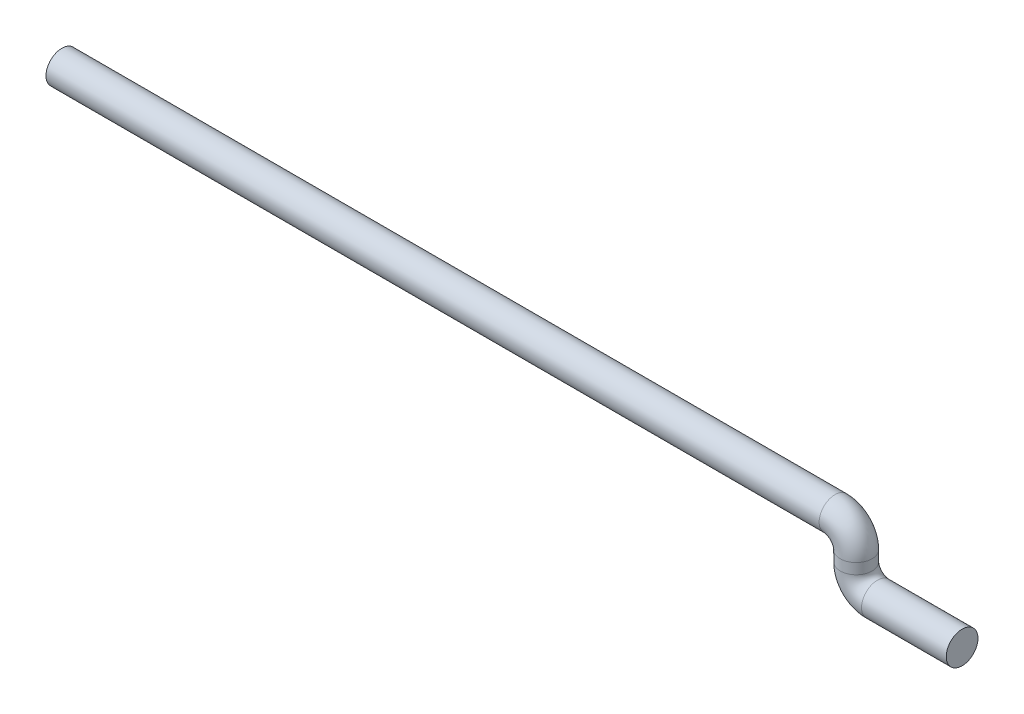
ISO-10303-21;
HEADER;
FILE_DESCRIPTION(('STEP AP214'),'2;1');
FILE_NAME('part.step','',(''),(''),'','','');
FILE_SCHEMA(('AUTOMOTIVE_DESIGN { 1 0 10303 214 1 1 1 1 }'));
ENDSEC;
DATA;
#1=APPLICATION_CONTEXT('core data for automotive mechanical design processes');
#2=APPLICATION_PROTOCOL_DEFINITION('international standard','automotive_design',2000,#1);
#3=PRODUCT_CONTEXT('',#1,'mechanical');
#4=PRODUCT('Part','Part','',(#3));
#5=PRODUCT_RELATED_PRODUCT_CATEGORY('part','',(#4));
#6=PRODUCT_DEFINITION_FORMATION('','',#4);
#7=PRODUCT_DEFINITION_CONTEXT('part definition',#1,'design');
#8=PRODUCT_DEFINITION('design','',#6,#7);
#9=PRODUCT_DEFINITION_SHAPE('','',#8);
#10=(LENGTH_UNIT() NAMED_UNIT(*) SI_UNIT(.MILLI.,.METRE.));
#11=(NAMED_UNIT(*) PLANE_ANGLE_UNIT() SI_UNIT($,.RADIAN.));
#12=(NAMED_UNIT(*) SI_UNIT($,.STERADIAN.) SOLID_ANGLE_UNIT());
#13=UNCERTAINTY_MEASURE_WITH_UNIT(LENGTH_MEASURE(1.E-05),#10,'distance_accuracy_value','');
#14=(GEOMETRIC_REPRESENTATION_CONTEXT(3) GLOBAL_UNCERTAINTY_ASSIGNED_CONTEXT((#13)) GLOBAL_UNIT_ASSIGNED_CONTEXT((#10,
#11,#12)) REPRESENTATION_CONTEXT('',''));
#15=CARTESIAN_POINT('',(0.,0.,0.));
#16=DIRECTION('',(0.,0.,1.));
#17=DIRECTION('',(1.,0.,0.));
#18=AXIS2_PLACEMENT_3D('',#15,#16,#17);
#19=CARTESIAN_POINT('',(39.116,-2.54,0.));
#20=DIRECTION('',(1.,0.,0.));
#21=DIRECTION('',(0.,1.,0.));
#22=AXIS2_PLACEMENT_3D('',#19,#20,#21);
#23=CYLINDRICAL_SURFACE('',#22,0.762);
#24=CARTESIAN_POINT('',(39.116,-2.54,0.));
#25=DIRECTION('',(1.,0.,0.));
#26=DIRECTION('',(0.,0.,-1.));
#27=AXIS2_PLACEMENT_3D('',#24,#25,#26);
#28=CIRCLE('',#27,0.762);
#29=CARTESIAN_POINT('',(39.116,-3.302,0.));
#30=VERTEX_POINT('',#29);
#31=EDGE_CURVE('E39',#30,#30,#28,.T.);
#32=ORIENTED_EDGE('',*,*,#31,.T.);
#33=EDGE_LOOP('',(#32));
#34=FACE_BOUND('',#33,.T.);
#35=CARTESIAN_POINT('',(43.18,-2.54,0.));
#36=DIRECTION('',(1.,0.,0.));
#37=DIRECTION('',(0.,0.,-1.));
#38=AXIS2_PLACEMENT_3D('',#35,#36,#37);
#39=CIRCLE('',#38,0.762);
#40=CARTESIAN_POINT('',(43.18,-2.54,-0.762));
#41=VERTEX_POINT('',#40);
#42=EDGE_CURVE('E10',#41,#41,#39,.T.);
#43=ORIENTED_EDGE('',*,*,#42,.F.);
#44=EDGE_LOOP('',(#43));
#45=FACE_BOUND('',#44,.T.);
#46=ADVANCED_FACE('F33',(#34,#45),#23,.T.);
#47=CARTESIAN_POINT('',(39.116,-1.524,0.));
#48=DIRECTION('',(0.,0.,1.));
#49=DIRECTION('',(1.,0.,0.));
#50=AXIS2_PLACEMENT_3D('',#47,#48,#49);
#51=TOROIDAL_SURFACE('',#50,1.016,0.762);
#52=CARTESIAN_POINT('',(38.1,-1.524,0.));
#53=DIRECTION('',(0.,-1.,0.));
#54=DIRECTION('',(0.,0.,-1.));
#55=AXIS2_PLACEMENT_3D('',#52,#53,#54);
#56=CIRCLE('',#55,0.762);
#57=CARTESIAN_POINT('',(37.338,-1.52399999999999,0.));
#58=VERTEX_POINT('',#57);
#59=EDGE_CURVE('E43',#58,#58,#56,.T.);
#60=CARTESIAN_POINT('',(39.116,-1.524,0.));
#61=DIRECTION('',(0.,0.,1.));
#62=DIRECTION('',(1.,0.,0.));
#63=AXIS2_PLACEMENT_3D('',#60,#61,#62);
#64=CIRCLE('',#63,1.778);
#65=EDGE_CURVE('',#58,#30,#64,.T.);
#66=ORIENTED_EDGE('',*,*,#59,.T.);
#67=ORIENTED_EDGE('',*,*,#31,.F.);
#68=ORIENTED_EDGE('',*,*,#65,.T.);
#69=ORIENTED_EDGE('',*,*,#65,.F.);
#70=EDGE_LOOP('',(#66,#68,#67,#69));
#71=FACE_BOUND('',#70,.T.);
#72=ADVANCED_FACE('F77',(#71),#51,.T.);
#73=CARTESIAN_POINT('',(38.1,-1.01600000000001,0.));
#74=DIRECTION('',(0.,-1.,0.));
#75=DIRECTION('',(0.,0.,-1.));
#76=AXIS2_PLACEMENT_3D('',#73,#74,#75);
#77=CYLINDRICAL_SURFACE('',#76,0.762);
#78=CARTESIAN_POINT('',(38.1,-1.01600000000001,0.));
#79=DIRECTION('',(0.,-1.,0.));
#80=DIRECTION('',(0.,0.,-1.));
#81=AXIS2_PLACEMENT_3D('',#78,#79,#80);
#82=CIRCLE('',#81,0.762);
#83=CARTESIAN_POINT('',(38.862,-1.01600000000002,0.));
#84=VERTEX_POINT('',#83);
#85=EDGE_CURVE('E47',#84,#84,#82,.T.);
#86=ORIENTED_EDGE('',*,*,#85,.T.);
#87=EDGE_LOOP('',(#86));
#88=FACE_BOUND('',#87,.T.);
#89=ORIENTED_EDGE('',*,*,#59,.F.);
#90=EDGE_LOOP('',(#89));
#91=FACE_BOUND('',#90,.T.);
#92=ADVANCED_FACE('F81',(#88,#91),#77,.T.);
#93=CARTESIAN_POINT('',(37.084,-1.016,0.));
#94=DIRECTION('',(0.,0.,-1.));
#95=DIRECTION('',(-1.,0.,0.));
#96=AXIS2_PLACEMENT_3D('',#93,#94,#95);
#97=TOROIDAL_SURFACE('',#96,1.016,0.762);
#98=CARTESIAN_POINT('',(37.084,0.,0.));
#99=DIRECTION('',(1.,0.,0.));
#100=DIRECTION('',(0.,0.,-1.));
#101=AXIS2_PLACEMENT_3D('',#98,#99,#100);
#102=CIRCLE('',#101,0.762);
#103=CARTESIAN_POINT('',(37.084,0.762,0.));
#104=VERTEX_POINT('',#103);
#105=EDGE_CURVE('E52',#104,#104,#102,.T.);
#106=CARTESIAN_POINT('',(37.084,-1.016,0.));
#107=DIRECTION('',(0.,0.,-1.));
#108=DIRECTION('',(-1.,0.,0.));
#109=AXIS2_PLACEMENT_3D('',#106,#107,#108);
#110=CIRCLE('',#109,1.778);
#111=EDGE_CURVE('',#104,#84,#110,.T.);
#112=ORIENTED_EDGE('',*,*,#105,.T.);
#113=ORIENTED_EDGE('',*,*,#85,.F.);
#114=ORIENTED_EDGE('',*,*,#111,.T.);
#115=ORIENTED_EDGE('',*,*,#111,.F.);
#116=EDGE_LOOP('',(#112,#114,#113,#115));
#117=FACE_BOUND('',#116,.T.);
#118=ADVANCED_FACE('F59',(#117),#97,.T.);
#119=CARTESIAN_POINT('',(37.084,0.,0.));
#120=DIRECTION('',(-1.,0.,0.));
#121=DIRECTION('',(0.,0.,1.));
#122=AXIS2_PLACEMENT_3D('',#119,#120,#121);
#123=CYLINDRICAL_SURFACE('',#122,0.762);
#124=ORIENTED_EDGE('',*,*,#105,.F.);
#125=EDGE_LOOP('',(#124));
#126=FACE_BOUND('',#125,.T.);
#127=CARTESIAN_POINT('',(0.,0.,0.));
#128=DIRECTION('',(1.,0.,0.));
#129=DIRECTION('',(0.,0.,-1.));
#130=AXIS2_PLACEMENT_3D('',#127,#128,#129);
#131=CIRCLE('',#130,0.762);
#132=CARTESIAN_POINT('',(0.,0.,-0.762));
#133=VERTEX_POINT('',#132);
#134=EDGE_CURVE('E53',#133,#133,#131,.T.);
#135=ORIENTED_EDGE('',*,*,#134,.T.);
#136=EDGE_LOOP('',(#135));
#137=FACE_BOUND('',#136,.T.);
#138=ADVANCED_FACE('F62',(#126,#137),#123,.T.);
#139=CARTESIAN_POINT('',(43.18,-2.54,0.));
#140=DIRECTION('',(1.,0.,0.));
#141=DIRECTION('',(0.,0.,-1.));
#142=AXIS2_PLACEMENT_3D('',#139,#140,#141);
#143=PLANE('',#142);
#144=ORIENTED_EDGE('',*,*,#42,.T.);
#145=EDGE_LOOP('',(#144));
#146=FACE_BOUND('',#145,.T.);
#147=ADVANCED_FACE('F65',(#146),#143,.T.);
#148=CARTESIAN_POINT('',(0.,0.,0.));
#149=DIRECTION('',(1.,0.,0.));
#150=DIRECTION('',(0.,0.,-1.));
#151=AXIS2_PLACEMENT_3D('',#148,#149,#150);
#152=PLANE('',#151);
#153=ORIENTED_EDGE('',*,*,#134,.F.);
#154=EDGE_LOOP('',(#153));
#155=FACE_BOUND('',#154,.T.);
#156=ADVANCED_FACE('F69',(#155),#152,.F.);
#157=CLOSED_SHELL('',(#46,#72,#92,#118,#138,#147,#156));
#158=MANIFOLD_SOLID_BREP('B2',#157);
#159=ADVANCED_BREP_SHAPE_REPRESENTATION('',(#18,#158),#14);
#160=SHAPE_DEFINITION_REPRESENTATION(#9,#159);
ENDSEC;
END-ISO-10303-21;
